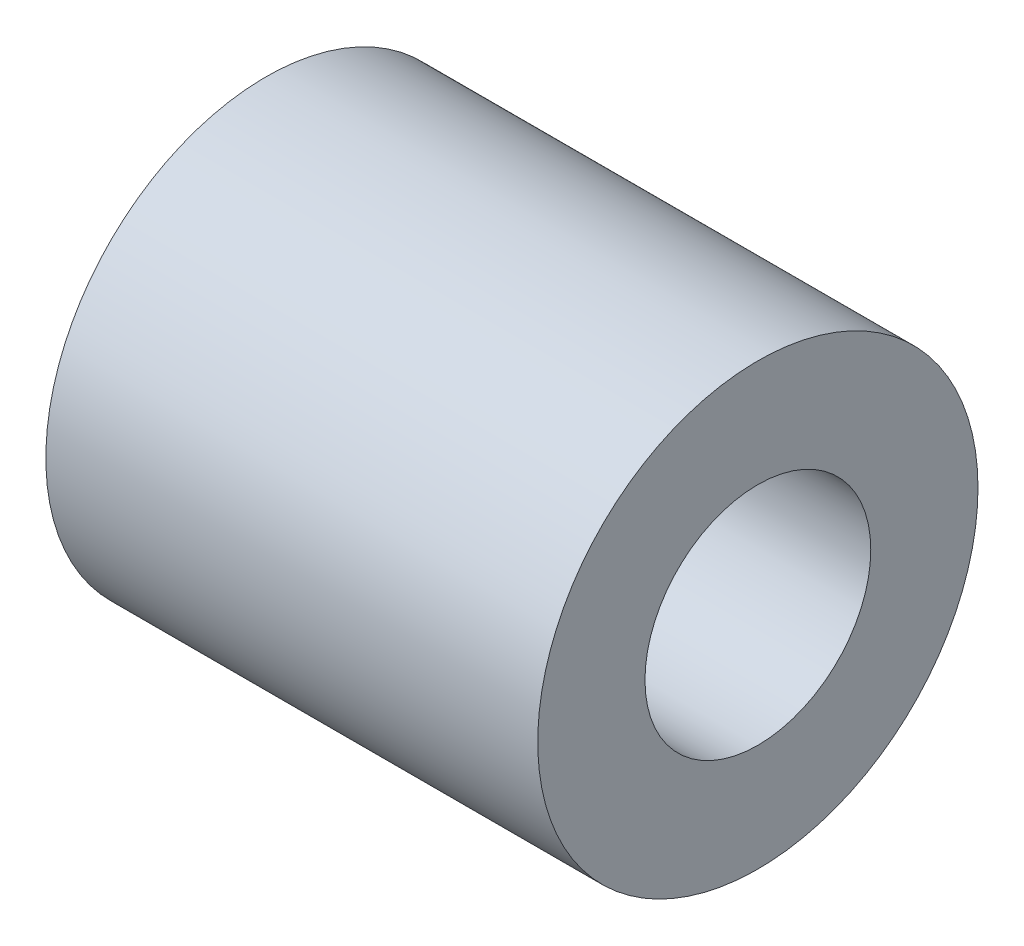
ISO-10303-21;
HEADER;
FILE_DESCRIPTION(('STEP AP214'),'2;1');
FILE_NAME('part.step','',(''),(''),'','','');
FILE_SCHEMA(('AUTOMOTIVE_DESIGN { 1 0 10303 214 1 1 1 1 }'));
ENDSEC;
DATA;
#1=APPLICATION_CONTEXT('core data for automotive mechanical design processes');
#2=APPLICATION_PROTOCOL_DEFINITION('international standard','automotive_design',2000,#1);
#3=PRODUCT_CONTEXT('',#1,'mechanical');
#4=PRODUCT('Part','Part','',(#3));
#5=PRODUCT_RELATED_PRODUCT_CATEGORY('part','',(#4));
#6=PRODUCT_DEFINITION_FORMATION('','',#4);
#7=PRODUCT_DEFINITION_CONTEXT('part definition',#1,'design');
#8=PRODUCT_DEFINITION('design','',#6,#7);
#9=PRODUCT_DEFINITION_SHAPE('','',#8);
#10=(LENGTH_UNIT() NAMED_UNIT(*) SI_UNIT(.MILLI.,.METRE.));
#11=(NAMED_UNIT(*) PLANE_ANGLE_UNIT() SI_UNIT($,.RADIAN.));
#12=(NAMED_UNIT(*) SI_UNIT($,.STERADIAN.) SOLID_ANGLE_UNIT());
#13=UNCERTAINTY_MEASURE_WITH_UNIT(LENGTH_MEASURE(1.E-05),#10,'distance_accuracy_value','');
#14=(GEOMETRIC_REPRESENTATION_CONTEXT(3) GLOBAL_UNCERTAINTY_ASSIGNED_CONTEXT((#13)) GLOBAL_UNIT_ASSIGNED_CONTEXT((#10,
#11,#12)) REPRESENTATION_CONTEXT('',''));
#15=CARTESIAN_POINT('',(0.,0.,0.));
#16=DIRECTION('',(0.,0.,1.));
#17=DIRECTION('',(1.,0.,0.));
#18=AXIS2_PLACEMENT_3D('',#15,#16,#17);
#19=CARTESIAN_POINT('',(4.335,0.,0.));
#20=DIRECTION('',(1.,0.,0.));
#21=DIRECTION('',(0.,0.,-1.));
#22=AXIS2_PLACEMENT_3D('',#19,#20,#21);
#23=PLANE('',#22);
#24=CARTESIAN_POINT('',(4.335,0.,0.));
#25=DIRECTION('',(1.,0.,0.));
#26=DIRECTION('',(0.,0.,-1.));
#27=AXIS2_PLACEMENT_3D('',#24,#25,#26);
#28=CIRCLE('',#27,3.88);
#29=CARTESIAN_POINT('',(4.335,0.,-3.88));
#30=VERTEX_POINT('',#29);
#31=EDGE_CURVE('E10',#30,#30,#28,.T.);
#32=ORIENTED_EDGE('',*,*,#31,.T.);
#33=EDGE_LOOP('',(#32));
#34=FACE_BOUND('',#33,.T.);
#35=CARTESIAN_POINT('',(4.335,0.,0.));
#36=DIRECTION('',(1.,0.,0.));
#37=DIRECTION('',(0.,0.,-1.));
#38=AXIS2_PLACEMENT_3D('',#35,#36,#37);
#39=CIRCLE('',#38,1.99);
#40=CARTESIAN_POINT('',(4.335,0.,-1.99));
#41=VERTEX_POINT('',#40);
#42=EDGE_CURVE('E46',#41,#41,#39,.T.);
#43=ORIENTED_EDGE('',*,*,#42,.F.);
#44=EDGE_LOOP('',(#43));
#45=FACE_BOUND('',#44,.T.);
#46=ADVANCED_FACE('F35',(#34,#45),#23,.T.);
#47=CARTESIAN_POINT('',(-4.335,0.,0.));
#48=DIRECTION('',(1.,0.,0.));
#49=DIRECTION('',(0.,0.,-1.));
#50=AXIS2_PLACEMENT_3D('',#47,#48,#49);
#51=PLANE('',#50);
#52=CARTESIAN_POINT('',(-4.335,0.,0.));
#53=DIRECTION('',(1.,0.,0.));
#54=DIRECTION('',(0.,0.,-1.));
#55=AXIS2_PLACEMENT_3D('',#52,#53,#54);
#56=CIRCLE('',#55,3.88);
#57=CARTESIAN_POINT('',(-4.335,0.,-3.88));
#58=VERTEX_POINT('',#57);
#59=EDGE_CURVE('E39',#58,#58,#56,.T.);
#60=ORIENTED_EDGE('',*,*,#59,.F.);
#61=EDGE_LOOP('',(#60));
#62=FACE_BOUND('',#61,.T.);
#63=CARTESIAN_POINT('',(-4.335,0.,0.));
#64=DIRECTION('',(1.,0.,0.));
#65=DIRECTION('',(0.,0.,-1.));
#66=AXIS2_PLACEMENT_3D('',#63,#64,#65);
#67=CIRCLE('',#66,1.99);
#68=CARTESIAN_POINT('',(-4.335,0.,-1.99));
#69=VERTEX_POINT('',#68);
#70=EDGE_CURVE('E48',#69,#69,#67,.T.);
#71=ORIENTED_EDGE('',*,*,#70,.T.);
#72=EDGE_LOOP('',(#71));
#73=FACE_BOUND('',#72,.T.);
#74=ADVANCED_FACE('F58',(#62,#73),#51,.F.);
#75=CARTESIAN_POINT('',(4.335,0.,0.));
#76=DIRECTION('',(-1.,0.,0.));
#77=DIRECTION('',(0.,0.,1.));
#78=AXIS2_PLACEMENT_3D('',#75,#76,#77);
#79=CYLINDRICAL_SURFACE('',#78,3.88);
#80=ORIENTED_EDGE('',*,*,#31,.F.);
#81=EDGE_LOOP('',(#80));
#82=FACE_BOUND('',#81,.T.);
#83=ORIENTED_EDGE('',*,*,#59,.T.);
#84=EDGE_LOOP('',(#83));
#85=FACE_BOUND('',#84,.T.);
#86=ADVANCED_FACE('F37',(#82,#85),#79,.T.);
#87=CARTESIAN_POINT('',(4.335,0.,0.));
#88=DIRECTION('',(-1.,0.,0.));
#89=DIRECTION('',(0.,0.,1.));
#90=AXIS2_PLACEMENT_3D('',#87,#88,#89);
#91=CYLINDRICAL_SURFACE('',#90,1.99);
#92=ORIENTED_EDGE('',*,*,#42,.T.);
#93=EDGE_LOOP('',(#92));
#94=FACE_BOUND('',#93,.T.);
#95=ORIENTED_EDGE('',*,*,#70,.F.);
#96=EDGE_LOOP('',(#95));
#97=FACE_BOUND('',#96,.T.);
#98=ADVANCED_FACE('F54',(#94,#97),#91,.F.);
#99=CLOSED_SHELL('',(#46,#74,#86,#98));
#100=MANIFOLD_SOLID_BREP('B2',#99);
#101=ADVANCED_BREP_SHAPE_REPRESENTATION('',(#18,#100),#14);
#102=SHAPE_DEFINITION_REPRESENTATION(#9,#101);
ENDSEC;
END-ISO-10303-21;
